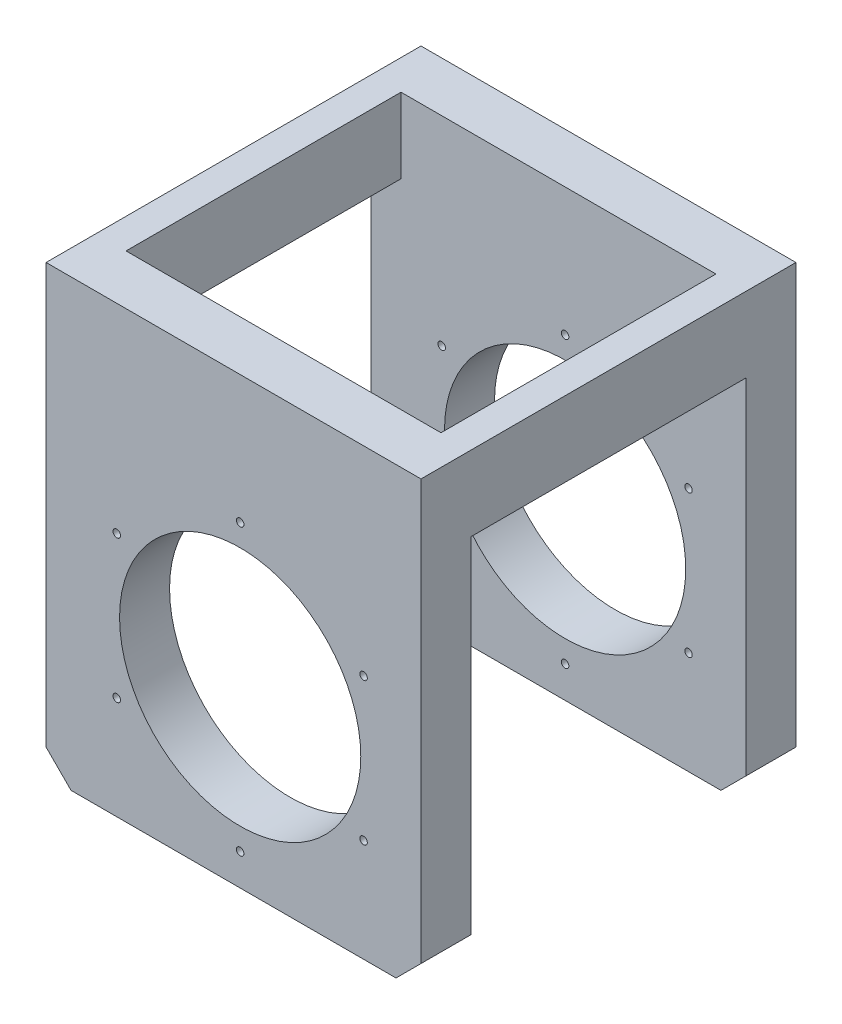
ISO-10303-21;
HEADER;
FILE_DESCRIPTION(('STEP AP214'),'2;1');
FILE_NAME('part.step','',(''),(''),'','','');
FILE_SCHEMA(('AUTOMOTIVE_DESIGN { 1 0 10303 214 1 1 1 1 }'));
ENDSEC;
DATA;
#1=APPLICATION_CONTEXT('core data for automotive mechanical design processes');
#2=APPLICATION_PROTOCOL_DEFINITION('international standard','automotive_design',2000,#1);
#3=PRODUCT_CONTEXT('',#1,'mechanical');
#4=PRODUCT('Part','Part','',(#3));
#5=PRODUCT_RELATED_PRODUCT_CATEGORY('part','',(#4));
#6=PRODUCT_DEFINITION_FORMATION('','',#4);
#7=PRODUCT_DEFINITION_CONTEXT('part definition',#1,'design');
#8=PRODUCT_DEFINITION('design','',#6,#7);
#9=PRODUCT_DEFINITION_SHAPE('','',#8);
#10=(LENGTH_UNIT() NAMED_UNIT(*) SI_UNIT(.MILLI.,.METRE.));
#11=(NAMED_UNIT(*) PLANE_ANGLE_UNIT() SI_UNIT($,.RADIAN.));
#12=(NAMED_UNIT(*) SI_UNIT($,.STERADIAN.) SOLID_ANGLE_UNIT());
#13=UNCERTAINTY_MEASURE_WITH_UNIT(LENGTH_MEASURE(1.E-05),#10,'distance_accuracy_value','');
#14=(GEOMETRIC_REPRESENTATION_CONTEXT(3) GLOBAL_UNCERTAINTY_ASSIGNED_CONTEXT((#13)) GLOBAL_UNIT_ASSIGNED_CONTEXT((#10,
#11,#12)) REPRESENTATION_CONTEXT('',''));
#15=CARTESIAN_POINT('',(0.,0.,0.));
#16=DIRECTION('',(0.,0.,1.));
#17=DIRECTION('',(1.,0.,0.));
#18=AXIS2_PLACEMENT_3D('',#15,#16,#17);
#19=CARTESIAN_POINT('',(-75.,-200.,20.));
#20=DIRECTION('',(0.,1.,0.));
#21=DIRECTION('',(0.,0.,1.));
#22=AXIS2_PLACEMENT_3D('',#19,#20,#21);
#23=PLANE('',#22);
#24=DIRECTION('',(1.,0.,0.));
#25=VECTOR('',#24,1.);
#26=CARTESIAN_POINT('',(0.,-200.,0.));
#27=LINE('',#26,#25);
#28=CARTESIAN_POINT('',(-65.,-200.,0.));
#29=VERTEX_POINT('',#28);
#30=CARTESIAN_POINT('',(64.9999999999999,-200.,0.));
#31=VERTEX_POINT('',#30);
#32=EDGE_CURVE('E410',#29,#31,#27,.T.);
#33=ORIENTED_EDGE('',*,*,#32,.T.);
#34=DIRECTION('',(0.,0.,1.));
#35=VECTOR('',#34,1.);
#36=CARTESIAN_POINT('',(64.9999999999999,-200.,20.));
#37=LINE('',#36,#35);
#38=CARTESIAN_POINT('',(64.9999999999999,-200.,20.));
#39=VERTEX_POINT('',#38);
#40=EDGE_CURVE('E275',#31,#39,#37,.T.);
#41=ORIENTED_EDGE('',*,*,#40,.T.);
#42=DIRECTION('',(1.,0.,0.));
#43=VECTOR('',#42,1.);
#44=CARTESIAN_POINT('',(-75.,-200.,20.));
#45=LINE('',#44,#43);
#46=CARTESIAN_POINT('',(-65.,-200.,20.));
#47=VERTEX_POINT('',#46);
#48=EDGE_CURVE('E245',#47,#39,#45,.T.);
#49=ORIENTED_EDGE('',*,*,#48,.F.);
#50=DIRECTION('',(0.,0.,-1.));
#51=VECTOR('',#50,1.);
#52=CARTESIAN_POINT('',(-65.,-200.,0.));
#53=LINE('',#52,#51);
#54=EDGE_CURVE('E271',#47,#29,#53,.T.);
#55=ORIENTED_EDGE('',*,*,#54,.T.);
#56=EDGE_LOOP('',(#33,#41,#49,#55));
#57=FACE_BOUND('',#56,.T.);
#58=ADVANCED_FACE('F100',(#57),#23,.F.);
#59=CARTESIAN_POINT('',(2.65519084204185,-130.335551325079,20.));
#60=DIRECTION('',(0.,0.,-1.));
#61=DIRECTION('',(-1.,0.,0.));
#62=AXIS2_PLACEMENT_3D('',#59,#60,#61);
#63=CYLINDRICAL_SURFACE('',#62,48.25);
#64=CARTESIAN_POINT('',(2.65519084204185,-130.335551325079,20.));
#65=DIRECTION('',(0.,0.,1.));
#66=DIRECTION('',(1.,0.,0.));
#67=AXIS2_PLACEMENT_3D('',#64,#65,#66);
#68=CIRCLE('',#67,48.25);
#69=CARTESIAN_POINT('',(50.9051908420419,-130.335551325079,20.));
#70=VERTEX_POINT('',#69);
#71=EDGE_CURVE('E351',#70,#70,#68,.T.);
#72=ORIENTED_EDGE('',*,*,#71,.T.);
#73=EDGE_LOOP('',(#72));
#74=FACE_BOUND('',#73,.T.);
#75=CARTESIAN_POINT('',(2.65519084204185,-130.335551325079,0.));
#76=DIRECTION('',(0.,0.,1.));
#77=DIRECTION('',(1.,0.,0.));
#78=AXIS2_PLACEMENT_3D('',#75,#76,#77);
#79=CIRCLE('',#78,48.25);
#80=CARTESIAN_POINT('',(50.9051908420419,-130.335551325079,0.));
#81=VERTEX_POINT('',#80);
#82=EDGE_CURVE('E345',#81,#81,#79,.T.);
#83=ORIENTED_EDGE('',*,*,#82,.F.);
#84=EDGE_LOOP('',(#83));
#85=FACE_BOUND('',#84,.T.);
#86=ADVANCED_FACE('F441',(#74,#85),#63,.F.);
#87=CARTESIAN_POINT('',(75.,-190.,20.));
#88=DIRECTION('',(-0.707106781186547,0.707106781186547,0.));
#89=DIRECTION('',(0.,0.,-1.));
#90=AXIS2_PLACEMENT_3D('',#87,#88,#89);
#91=PLANE('',#90);
#92=DIRECTION('',(-0.707106781186548,-0.707106781186548,0.));
#93=VECTOR('',#92,1.);
#94=CARTESIAN_POINT('',(132.5,-132.5,20.));
#95=LINE('',#94,#93);
#96=CARTESIAN_POINT('',(75.,-190.,20.));
#97=VERTEX_POINT('',#96);
#98=EDGE_CURVE('E281',#39,#97,#95,.F.);
#99=ORIENTED_EDGE('',*,*,#98,.F.);
#100=ORIENTED_EDGE('',*,*,#40,.F.);
#101=DIRECTION('',(0.707106781186548,0.707106781186548,0.));
#102=VECTOR('',#101,1.);
#103=CARTESIAN_POINT('',(75.,-190.,0.));
#104=LINE('',#103,#102);
#105=CARTESIAN_POINT('',(75.,-190.,0.));
#106=VERTEX_POINT('',#105);
#107=EDGE_CURVE('E268',#106,#31,#104,.F.);
#108=ORIENTED_EDGE('',*,*,#107,.F.);
#109=DIRECTION('',(0.,0.,-1.));
#110=VECTOR('',#109,1.);
#111=CARTESIAN_POINT('',(75.,-190.,20.));
#112=LINE('',#111,#110);
#113=EDGE_CURVE('E261',#97,#106,#112,.T.);
#114=ORIENTED_EDGE('',*,*,#113,.F.);
#115=EDGE_LOOP('',(#99,#100,#108,#114));
#116=FACE_BOUND('',#115,.T.);
#117=ADVANCED_FACE('F366',(#116),#91,.F.);
#118=CARTESIAN_POINT('',(-65.,-200.,20.));
#119=DIRECTION('',(-0.707106781186549,-0.707106781186546,0.));
#120=DIRECTION('',(0.,0.,1.));
#121=AXIS2_PLACEMENT_3D('',#118,#119,#120);
#122=PLANE('',#121);
#123=DIRECTION('',(0.707106781186546,-0.707106781186549,0.));
#124=VECTOR('',#123,1.);
#125=CARTESIAN_POINT('',(-132.5,-132.499999999999,20.));
#126=LINE('',#125,#124);
#127=CARTESIAN_POINT('',(-75.,-190.,20.));
#128=VERTEX_POINT('',#127);
#129=EDGE_CURVE('E278',#128,#47,#126,.T.);
#130=ORIENTED_EDGE('',*,*,#129,.F.);
#131=DIRECTION('',(0.,0.,1.));
#132=VECTOR('',#131,1.);
#133=CARTESIAN_POINT('',(-75.,-190.,20.));
#134=LINE('',#133,#132);
#135=CARTESIAN_POINT('',(-75.,-190.,0.));
#136=VERTEX_POINT('',#135);
#137=EDGE_CURVE('E110',#136,#128,#134,.T.);
#138=ORIENTED_EDGE('',*,*,#137,.F.);
#139=DIRECTION('',(-0.707106781186546,0.707106781186549,0.));
#140=VECTOR('',#139,1.);
#141=CARTESIAN_POINT('',(-65.,-200.,0.));
#142=LINE('',#141,#140);
#143=EDGE_CURVE('E265',#29,#136,#142,.T.);
#144=ORIENTED_EDGE('',*,*,#143,.F.);
#145=ORIENTED_EDGE('',*,*,#54,.F.);
#146=EDGE_LOOP('',(#130,#138,#144,#145));
#147=FACE_BOUND('',#146,.T.);
#148=ADVANCED_FACE('F103',(#147),#122,.T.);
#149=CARTESIAN_POINT('',(75.,-52.0855513250788,-110.));
#150=DIRECTION('',(0.,1.,0.));
#151=DIRECTION('',(0.,0.,1.));
#152=AXIS2_PLACEMENT_3D('',#149,#150,#151);
#153=PLANE('',#152);
#154=DIRECTION('',(0.,0.,-1.));
#155=VECTOR('',#154,1.);
#156=CARTESIAN_POINT('',(63.,-52.0855513250788,-110.));
#157=LINE('',#156,#155);
#158=CARTESIAN_POINT('',(63.,-52.0855513250788,0.));
#159=VERTEX_POINT('',#158);
#160=CARTESIAN_POINT('',(63.,-52.0855513250788,-110.));
#161=VERTEX_POINT('',#160);
#162=EDGE_CURVE('E404',#159,#161,#157,.T.);
#163=ORIENTED_EDGE('',*,*,#162,.T.);
#164=DIRECTION('',(-1.,0.,0.));
#165=VECTOR('',#164,1.);
#166=CARTESIAN_POINT('',(75.,-52.0855513250788,-110.));
#167=LINE('',#166,#165);
#168=CARTESIAN_POINT('',(75.,-52.0855513250788,-110.));
#169=VERTEX_POINT('',#168);
#170=EDGE_CURVE('E395',#169,#161,#167,.T.);
#171=ORIENTED_EDGE('',*,*,#170,.F.);
#172=DIRECTION('',(0.,0.,-1.));
#173=VECTOR('',#172,1.);
#174=CARTESIAN_POINT('',(75.,-52.0855513250788,-110.));
#175=LINE('',#174,#173);
#176=CARTESIAN_POINT('',(75.,-52.0855513250788,0.));
#177=VERTEX_POINT('',#176);
#178=EDGE_CURVE('E311',#177,#169,#175,.T.);
#179=ORIENTED_EDGE('',*,*,#178,.F.);
#180=DIRECTION('',(-1.,0.,0.));
#181=VECTOR('',#180,1.);
#182=CARTESIAN_POINT('',(75.,-52.0855513250788,0.));
#183=LINE('',#182,#181);
#184=EDGE_CURVE('E376',#177,#159,#183,.T.);
#185=ORIENTED_EDGE('',*,*,#184,.T.);
#186=EDGE_LOOP('',(#163,#171,#179,#185));
#187=FACE_BOUND('',#186,.T.);
#188=ADVANCED_FACE('F438',(#187),#153,.F.);
#189=CARTESIAN_POINT('',(75.,-190.,20.));
#190=DIRECTION('',(-0.707106781186547,0.707106781186547,0.));
#191=DIRECTION('',(0.,0.,-1.));
#192=AXIS2_PLACEMENT_3D('',#189,#190,#191);
#193=PLANE('',#192);
#194=DIRECTION('',(-0.707106781186548,-0.707106781186548,0.));
#195=VECTOR('',#194,1.);
#196=CARTESIAN_POINT('',(75.,-190.,-110.));
#197=LINE('',#196,#195);
#198=CARTESIAN_POINT('',(64.9999999999999,-200.,-110.));
#199=VERTEX_POINT('',#198);
#200=CARTESIAN_POINT('',(75.,-190.,-110.));
#201=VERTEX_POINT('',#200);
#202=EDGE_CURVE('E290',#199,#201,#197,.F.);
#203=ORIENTED_EDGE('',*,*,#202,.F.);
#204=DIRECTION('',(0.,0.,1.));
#205=VECTOR('',#204,1.);
#206=CARTESIAN_POINT('',(64.9999999999999,-200.,20.));
#207=LINE('',#206,#205);
#208=CARTESIAN_POINT('',(64.9999999999999,-200.,-130.));
#209=VERTEX_POINT('',#208);
#210=EDGE_CURVE('E287',#209,#199,#207,.T.);
#211=ORIENTED_EDGE('',*,*,#210,.F.);
#212=DIRECTION('',(0.707106781186548,0.707106781186548,0.));
#213=VECTOR('',#212,1.);
#214=CARTESIAN_POINT('',(132.5,-132.5,-130.));
#215=LINE('',#214,#213);
#216=CARTESIAN_POINT('',(75.,-190.,-130.));
#217=VERTEX_POINT('',#216);
#218=EDGE_CURVE('E284',#217,#209,#215,.F.);
#219=ORIENTED_EDGE('',*,*,#218,.F.);
#220=DIRECTION('',(0.,0.,-1.));
#221=VECTOR('',#220,1.);
#222=CARTESIAN_POINT('',(75.,-190.,20.));
#223=LINE('',#222,#221);
#224=EDGE_CURVE('E257',#201,#217,#223,.T.);
#225=ORIENTED_EDGE('',*,*,#224,.F.);
#226=EDGE_LOOP('',(#203,#211,#219,#225));
#227=FACE_BOUND('',#226,.T.);
#228=ADVANCED_FACE('F316',(#227),#193,.F.);
#229=DIRECTION('',(-1.,0.,0.));
#230=VECTOR('',#229,1.);
#231=CARTESIAN_POINT('',(75.,-200.,-130.));
#232=LINE('',#231,#230);
#233=CARTESIAN_POINT('',(-65.,-200.,-130.));
#234=VERTEX_POINT('',#233);
#235=EDGE_CURVE('E320',#209,#234,#232,.T.);
#236=ORIENTED_EDGE('',*,*,#235,.F.);
#237=ORIENTED_EDGE('',*,*,#210,.T.);
#238=DIRECTION('',(1.,0.,0.));
#239=VECTOR('',#238,1.);
#240=CARTESIAN_POINT('',(0.,-200.,-110.));
#241=LINE('',#240,#239);
#242=CARTESIAN_POINT('',(-65.,-200.,-110.));
#243=VERTEX_POINT('',#242);
#244=EDGE_CURVE('E303',#243,#199,#241,.T.);
#245=ORIENTED_EDGE('',*,*,#244,.F.);
#246=DIRECTION('',(0.,0.,-1.));
#247=VECTOR('',#246,1.);
#248=CARTESIAN_POINT('',(-65.,-200.,-130.));
#249=LINE('',#248,#247);
#250=EDGE_CURVE('E238',#243,#234,#249,.T.);
#251=ORIENTED_EDGE('',*,*,#250,.T.);
#252=EDGE_LOOP('',(#236,#237,#245,#251));
#253=FACE_BOUND('',#252,.T.);
#254=ADVANCED_FACE('F324',(#253),#23,.F.);
#255=CARTESIAN_POINT('',(-65.,-200.,20.));
#256=DIRECTION('',(-0.707106781186549,-0.707106781186546,0.));
#257=DIRECTION('',(0.,0.,1.));
#258=AXIS2_PLACEMENT_3D('',#255,#256,#257);
#259=PLANE('',#258);
#260=DIRECTION('',(0.707106781186546,-0.707106781186549,0.));
#261=VECTOR('',#260,1.);
#262=CARTESIAN_POINT('',(-65.,-200.,-110.));
#263=LINE('',#262,#261);
#264=CARTESIAN_POINT('',(-75.,-190.,-110.));
#265=VERTEX_POINT('',#264);
#266=EDGE_CURVE('E254',#265,#243,#263,.T.);
#267=ORIENTED_EDGE('',*,*,#266,.F.);
#268=DIRECTION('',(0.,0.,1.));
#269=VECTOR('',#268,1.);
#270=CARTESIAN_POINT('',(-75.,-190.,-110.));
#271=LINE('',#270,#269);
#272=CARTESIAN_POINT('',(-75.,-190.,-130.));
#273=VERTEX_POINT('',#272);
#274=EDGE_CURVE('E251',#273,#265,#271,.T.);
#275=ORIENTED_EDGE('',*,*,#274,.F.);
#276=DIRECTION('',(-0.707106781186546,0.707106781186549,0.));
#277=VECTOR('',#276,1.);
#278=CARTESIAN_POINT('',(-132.5,-132.499999999999,-130.));
#279=LINE('',#278,#277);
#280=EDGE_CURVE('E243',#234,#273,#279,.T.);
#281=ORIENTED_EDGE('',*,*,#280,.F.);
#282=ORIENTED_EDGE('',*,*,#250,.F.);
#283=EDGE_LOOP('',(#267,#275,#281,#282));
#284=FACE_BOUND('',#283,.T.);
#285=ADVANCED_FACE('F435',(#284),#259,.T.);
#286=DIRECTION('',(0.,0.,1.));
#287=VECTOR('',#286,1.);
#288=CARTESIAN_POINT('',(-63.,-52.0855513250788,-110.));
#289=LINE('',#288,#287);
#290=CARTESIAN_POINT('',(-63.,-52.0855513250788,-110.));
#291=VERTEX_POINT('',#290);
#292=CARTESIAN_POINT('',(-63.,-52.0855513250788,0.));
#293=VERTEX_POINT('',#292);
#294=EDGE_CURVE('E398',#291,#293,#289,.T.);
#295=ORIENTED_EDGE('',*,*,#294,.T.);
#296=CARTESIAN_POINT('',(-75.,-52.0855513250788,0.));
#297=VERTEX_POINT('',#296);
#298=EDGE_CURVE('E313',#293,#297,#183,.T.);
#299=ORIENTED_EDGE('',*,*,#298,.T.);
#300=DIRECTION('',(0.,0.,-1.));
#301=VECTOR('',#300,1.);
#302=CARTESIAN_POINT('',(-75.,-52.0855513250788,-110.));
#303=LINE('',#302,#301);
#304=CARTESIAN_POINT('',(-75.,-52.0855513250788,-110.));
#305=VERTEX_POINT('',#304);
#306=EDGE_CURVE('E384',#297,#305,#303,.T.);
#307=ORIENTED_EDGE('',*,*,#306,.T.);
#308=EDGE_CURVE('E399',#291,#305,#167,.T.);
#309=ORIENTED_EDGE('',*,*,#308,.F.);
#310=EDGE_LOOP('',(#295,#299,#307,#309));
#311=FACE_BOUND('',#310,.T.);
#312=ADVANCED_FACE('F423',(#311),#153,.F.);
#313=CARTESIAN_POINT('',(2.65519084204185,-130.335551325079,-130.));
#314=DIRECTION('',(0.,0.,1.));
#315=DIRECTION('',(1.,0.,0.));
#316=AXIS2_PLACEMENT_3D('',#313,#314,#315);
#317=CYLINDRICAL_SURFACE('',#316,48.25);
#318=CARTESIAN_POINT('',(2.65519084204185,-130.335551325079,-130.));
#319=DIRECTION('',(0.,0.,-1.));
#320=DIRECTION('',(-1.,0.,0.));
#321=AXIS2_PLACEMENT_3D('',#318,#319,#320);
#322=CIRCLE('',#321,48.25);
#323=CARTESIAN_POINT('',(-45.5948091579581,-130.335551325079,-130.));
#324=VERTEX_POINT('',#323);
#325=EDGE_CURVE('E333',#324,#324,#322,.T.);
#326=ORIENTED_EDGE('',*,*,#325,.T.);
#327=EDGE_LOOP('',(#326));
#328=FACE_BOUND('',#327,.T.);
#329=CARTESIAN_POINT('',(2.65519084204185,-130.335551325079,-110.));
#330=DIRECTION('',(0.,0.,-1.));
#331=DIRECTION('',(-1.,0.,0.));
#332=AXIS2_PLACEMENT_3D('',#329,#330,#331);
#333=CIRCLE('',#332,48.25);
#334=CARTESIAN_POINT('',(-45.5948091579581,-130.335551325079,-110.));
#335=VERTEX_POINT('',#334);
#336=EDGE_CURVE('E413',#335,#335,#333,.T.);
#337=ORIENTED_EDGE('',*,*,#336,.F.);
#338=EDGE_LOOP('',(#337));
#339=FACE_BOUND('',#338,.T.);
#340=ADVANCED_FACE('F421',(#328,#339),#317,.F.);
#341=CARTESIAN_POINT('',(0.,0.,-110.));
#342=DIRECTION('',(0.,0.,-1.));
#343=DIRECTION('',(-1.,0.,0.));
#344=AXIS2_PLACEMENT_3D('',#341,#342,#343);
#345=PLANE('',#344);
#346=CARTESIAN_POINT('',(2.65519084204629,-187.335551325079,-110.));
#347=DIRECTION('',(0.,0.,-1.));
#348=DIRECTION('',(-1.,0.,0.));
#349=AXIS2_PLACEMENT_3D('',#346,#347,#348);
#350=CIRCLE('',#349,1.5);
#351=CARTESIAN_POINT('',(1.15519084204629,-187.335551325079,-110.));
#352=VERTEX_POINT('',#351);
#353=EDGE_CURVE('E544',#352,#352,#350,.T.);
#354=ORIENTED_EDGE('',*,*,#353,.T.);
#355=EDGE_LOOP('',(#354));
#356=FACE_BOUND('',#355,.T.);
#357=CARTESIAN_POINT('',(52.0186388577584,-158.835551325077,-110.));
#358=DIRECTION('',(0.,0.,-1.));
#359=DIRECTION('',(-1.,0.,0.));
#360=AXIS2_PLACEMENT_3D('',#357,#358,#359);
#361=CIRCLE('',#360,1.5);
#362=CARTESIAN_POINT('',(50.5186388577584,-158.835551325077,-110.));
#363=VERTEX_POINT('',#362);
#364=EDGE_CURVE('E554',#363,#363,#361,.T.);
#365=ORIENTED_EDGE('',*,*,#364,.T.);
#366=EDGE_LOOP('',(#365));
#367=FACE_BOUND('',#366,.T.);
#368=CARTESIAN_POINT('',(-46.7082571736678,-158.83555132508,-110.));
#369=DIRECTION('',(0.,0.,-1.));
#370=DIRECTION('',(-1.,0.,0.));
#371=AXIS2_PLACEMENT_3D('',#368,#369,#370);
#372=CIRCLE('',#371,1.49999999999999);
#373=CARTESIAN_POINT('',(-48.2082571736678,-158.83555132508,-110.));
#374=VERTEX_POINT('',#373);
#375=EDGE_CURVE('E558',#374,#374,#372,.T.);
#376=ORIENTED_EDGE('',*,*,#375,.T.);
#377=EDGE_LOOP('',(#376));
#378=FACE_BOUND('',#377,.T.);
#379=CARTESIAN_POINT('',(2.65519084204185,-73.3355513250788,-110.));
#380=DIRECTION('',(0.,0.,-1.));
#381=DIRECTION('',(-1.,0.,0.));
#382=AXIS2_PLACEMENT_3D('',#379,#380,#381);
#383=CIRCLE('',#382,1.5);
#384=CARTESIAN_POINT('',(1.15519084204185,-73.3355513250788,-110.));
#385=VERTEX_POINT('',#384);
#386=EDGE_CURVE('E562',#385,#385,#383,.T.);
#387=ORIENTED_EDGE('',*,*,#386,.T.);
#388=EDGE_LOOP('',(#387));
#389=FACE_BOUND('',#388,.T.);
#390=CARTESIAN_POINT('',(-46.7082571736696,-101.83555132508,-110.));
#391=DIRECTION('',(0.,0.,-1.));
#392=DIRECTION('',(-1.,0.,0.));
#393=AXIS2_PLACEMENT_3D('',#390,#391,#392);
#394=CIRCLE('',#393,1.5);
#395=CARTESIAN_POINT('',(-48.2082571736696,-101.83555132508,-110.));
#396=VERTEX_POINT('',#395);
#397=EDGE_CURVE('E566',#396,#396,#394,.T.);
#398=ORIENTED_EDGE('',*,*,#397,.T.);
#399=EDGE_LOOP('',(#398));
#400=FACE_BOUND('',#399,.T.);
#401=CARTESIAN_POINT('',(52.0186388577561,-101.835551325077,-110.));
#402=DIRECTION('',(0.,0.,-1.));
#403=DIRECTION('',(-1.,0.,0.));
#404=AXIS2_PLACEMENT_3D('',#401,#402,#403);
#405=CIRCLE('',#404,1.5);
#406=CARTESIAN_POINT('',(50.5186388577561,-101.835551325077,-110.));
#407=VERTEX_POINT('',#406);
#408=EDGE_CURVE('E570',#407,#407,#405,.T.);
#409=ORIENTED_EDGE('',*,*,#408,.T.);
#410=EDGE_LOOP('',(#409));
#411=FACE_BOUND('',#410,.T.);
#412=ORIENTED_EDGE('',*,*,#336,.T.);
#413=EDGE_LOOP('',(#412));
#414=FACE_BOUND('',#413,.T.);
#415=DIRECTION('',(1.,0.,0.));
#416=VECTOR('',#415,1.);
#417=CARTESIAN_POINT('',(0.,-22.0855513250788,-110.));
#418=LINE('',#417,#416);
#419=CARTESIAN_POINT('',(-63.,-22.0855513250788,-110.));
#420=VERTEX_POINT('',#419);
#421=CARTESIAN_POINT('',(63.,-22.0855513250788,-110.));
#422=VERTEX_POINT('',#421);
#423=EDGE_CURVE('E12',#420,#422,#418,.T.);
#424=ORIENTED_EDGE('',*,*,#423,.F.);
#425=DIRECTION('',(0.,1.,0.));
#426=VECTOR('',#425,1.);
#427=CARTESIAN_POINT('',(-63.,-200.,-110.));
#428=LINE('',#427,#426);
#429=EDGE_CURVE('E340',#291,#420,#428,.T.);
#430=ORIENTED_EDGE('',*,*,#429,.F.);
#431=ORIENTED_EDGE('',*,*,#308,.T.);
#432=DIRECTION('',(0.,-1.,0.));
#433=VECTOR('',#432,1.);
#434=CARTESIAN_POINT('',(-75.,-200.,-110.));
#435=LINE('',#434,#433);
#436=EDGE_CURVE('E378',#305,#265,#435,.T.);
#437=ORIENTED_EDGE('',*,*,#436,.T.);
#438=ORIENTED_EDGE('',*,*,#266,.T.);
#439=ORIENTED_EDGE('',*,*,#244,.T.);
#440=ORIENTED_EDGE('',*,*,#202,.T.);
#441=DIRECTION('',(0.,-1.,0.));
#442=VECTOR('',#441,1.);
#443=CARTESIAN_POINT('',(75.,-200.,-110.));
#444=LINE('',#443,#442);
#445=EDGE_CURVE('E300',#169,#201,#444,.T.);
#446=ORIENTED_EDGE('',*,*,#445,.F.);
#447=ORIENTED_EDGE('',*,*,#170,.T.);
#448=DIRECTION('',(0.,-1.,0.));
#449=VECTOR('',#448,1.);
#450=CARTESIAN_POINT('',(63.,200.,-110.));
#451=LINE('',#450,#449);
#452=EDGE_CURVE('E337',#422,#161,#451,.T.);
#453=ORIENTED_EDGE('',*,*,#452,.F.);
#454=EDGE_LOOP('',(#424,#430,#431,#437,#438,#439,#440,#446,#447,#453));
#455=FACE_BOUND('',#454,.T.);
#456=ADVANCED_FACE('F298',(#356,#367,#378,#389,#400,#411,#414,#455),#345,.F.);
#457=CARTESIAN_POINT('',(-63.,-200.,-110.));
#458=DIRECTION('',(1.,0.,0.));
#459=DIRECTION('',(0.,0.,-1.));
#460=AXIS2_PLACEMENT_3D('',#457,#458,#459);
#461=PLANE('',#460);
#462=ORIENTED_EDGE('',*,*,#429,.T.);
#463=DIRECTION('',(0.,0.,1.));
#464=VECTOR('',#463,1.);
#465=CARTESIAN_POINT('',(-63.,-22.0855513250788,-110.));
#466=LINE('',#465,#464);
#467=CARTESIAN_POINT('',(-63.,-22.0855513250788,0.));
#468=VERTEX_POINT('',#467);
#469=EDGE_CURVE('E124',#420,#468,#466,.T.);
#470=ORIENTED_EDGE('',*,*,#469,.T.);
#471=DIRECTION('',(0.,1.,0.));
#472=VECTOR('',#471,1.);
#473=CARTESIAN_POINT('',(-63.,-200.,0.));
#474=LINE('',#473,#472);
#475=EDGE_CURVE('E341',#293,#468,#474,.T.);
#476=ORIENTED_EDGE('',*,*,#475,.F.);
#477=ORIENTED_EDGE('',*,*,#294,.F.);
#478=EDGE_LOOP('',(#462,#470,#476,#477));
#479=FACE_BOUND('',#478,.T.);
#480=ADVANCED_FACE('F431',(#479),#461,.T.);
#481=CARTESIAN_POINT('',(63.,200.,-110.));
#482=DIRECTION('',(-1.,0.,0.));
#483=DIRECTION('',(0.,0.,1.));
#484=AXIS2_PLACEMENT_3D('',#481,#482,#483);
#485=PLANE('',#484);
#486=DIRECTION('',(0.,-1.,0.));
#487=VECTOR('',#486,1.);
#488=CARTESIAN_POINT('',(63.,200.,0.));
#489=LINE('',#488,#487);
#490=CARTESIAN_POINT('',(63.,-22.0855513250788,0.));
#491=VERTEX_POINT('',#490);
#492=EDGE_CURVE('E331',#491,#159,#489,.T.);
#493=ORIENTED_EDGE('',*,*,#492,.F.);
#494=DIRECTION('',(0.,0.,-1.));
#495=VECTOR('',#494,1.);
#496=CARTESIAN_POINT('',(63.,-22.0855513250788,-110.));
#497=LINE('',#496,#495);
#498=EDGE_CURVE('E491',#491,#422,#497,.T.);
#499=ORIENTED_EDGE('',*,*,#498,.T.);
#500=ORIENTED_EDGE('',*,*,#452,.T.);
#501=ORIENTED_EDGE('',*,*,#162,.F.);
#502=EDGE_LOOP('',(#493,#499,#500,#501));
#503=FACE_BOUND('',#502,.T.);
#504=ADVANCED_FACE('F495',(#503),#485,.T.);
#505=CARTESIAN_POINT('',(0.,0.,-130.));
#506=DIRECTION('',(0.,0.,-1.));
#507=DIRECTION('',(-1.,0.,0.));
#508=AXIS2_PLACEMENT_3D('',#505,#506,#507);
#509=PLANE('',#508);
#510=CARTESIAN_POINT('',(2.65519084204629,-187.335551325079,-130.));
#511=DIRECTION('',(0.,0.,-1.));
#512=DIRECTION('',(-1.,0.,0.));
#513=AXIS2_PLACEMENT_3D('',#510,#511,#512);
#514=CIRCLE('',#513,1.5);
#515=CARTESIAN_POINT('',(1.15519084204629,-187.335551325079,-130.));
#516=VERTEX_POINT('',#515);
#517=EDGE_CURVE('E587',#516,#516,#514,.T.);
#518=ORIENTED_EDGE('',*,*,#517,.F.);
#519=EDGE_LOOP('',(#518));
#520=FACE_BOUND('',#519,.T.);
#521=CARTESIAN_POINT('',(52.0186388577584,-158.835551325077,-130.));
#522=DIRECTION('',(0.,0.,-1.));
#523=DIRECTION('',(-1.,0.,0.));
#524=AXIS2_PLACEMENT_3D('',#521,#522,#523);
#525=CIRCLE('',#524,1.5);
#526=CARTESIAN_POINT('',(50.5186388577584,-158.835551325077,-130.));
#527=VERTEX_POINT('',#526);
#528=EDGE_CURVE('E583',#527,#527,#525,.T.);
#529=ORIENTED_EDGE('',*,*,#528,.F.);
#530=EDGE_LOOP('',(#529));
#531=FACE_BOUND('',#530,.T.);
#532=CARTESIAN_POINT('',(-46.7082571736678,-158.83555132508,-130.));
#533=DIRECTION('',(0.,0.,-1.));
#534=DIRECTION('',(-1.,0.,0.));
#535=AXIS2_PLACEMENT_3D('',#532,#533,#534);
#536=CIRCLE('',#535,1.49999999999999);
#537=CARTESIAN_POINT('',(-48.2082571736678,-158.83555132508,-130.));
#538=VERTEX_POINT('',#537);
#539=EDGE_CURVE('E579',#538,#538,#536,.T.);
#540=ORIENTED_EDGE('',*,*,#539,.F.);
#541=EDGE_LOOP('',(#540));
#542=FACE_BOUND('',#541,.T.);
#543=CARTESIAN_POINT('',(2.65519084204185,-73.3355513250788,-130.));
#544=DIRECTION('',(0.,0.,-1.));
#545=DIRECTION('',(-1.,0.,0.));
#546=AXIS2_PLACEMENT_3D('',#543,#544,#545);
#547=CIRCLE('',#546,1.5);
#548=CARTESIAN_POINT('',(1.15519084204185,-73.3355513250788,-130.));
#549=VERTEX_POINT('',#548);
#550=EDGE_CURVE('E578',#549,#549,#547,.T.);
#551=ORIENTED_EDGE('',*,*,#550,.F.);
#552=EDGE_LOOP('',(#551));
#553=FACE_BOUND('',#552,.T.);
#554=CARTESIAN_POINT('',(-46.7082571736696,-101.83555132508,-130.));
#555=DIRECTION('',(0.,0.,-1.));
#556=DIRECTION('',(-1.,0.,0.));
#557=AXIS2_PLACEMENT_3D('',#554,#555,#556);
#558=CIRCLE('',#557,1.5);
#559=CARTESIAN_POINT('',(-48.2082571736696,-101.83555132508,-130.));
#560=VERTEX_POINT('',#559);
#561=EDGE_CURVE('E591',#560,#560,#558,.T.);
#562=ORIENTED_EDGE('',*,*,#561,.F.);
#563=EDGE_LOOP('',(#562));
#564=FACE_BOUND('',#563,.T.);
#565=CARTESIAN_POINT('',(52.0186388577561,-101.835551325077,-130.));
#566=DIRECTION('',(0.,0.,-1.));
#567=DIRECTION('',(-1.,0.,0.));
#568=AXIS2_PLACEMENT_3D('',#565,#566,#567);
#569=CIRCLE('',#568,1.5);
#570=CARTESIAN_POINT('',(50.5186388577561,-101.835551325077,-130.));
#571=VERTEX_POINT('',#570);
#572=EDGE_CURVE('E574',#571,#571,#569,.T.);
#573=ORIENTED_EDGE('',*,*,#572,.F.);
#574=EDGE_LOOP('',(#573));
#575=FACE_BOUND('',#574,.T.);
#576=ORIENTED_EDGE('',*,*,#325,.F.);
#577=EDGE_LOOP('',(#576));
#578=FACE_BOUND('',#577,.T.);
#579=DIRECTION('',(0.,1.,0.));
#580=VECTOR('',#579,1.);
#581=CARTESIAN_POINT('',(-75.,-200.,-130.));
#582=LINE('',#581,#580);
#583=CARTESIAN_POINT('',(-75.,-22.0855513250788,-130.));
#584=VERTEX_POINT('',#583);
#585=EDGE_CURVE('E327',#273,#584,#582,.T.);
#586=ORIENTED_EDGE('',*,*,#585,.T.);
#587=DIRECTION('',(1.,0.,0.));
#588=VECTOR('',#587,1.);
#589=CARTESIAN_POINT('',(0.,-22.0855513250788,-130.));
#590=LINE('',#589,#588);
#591=CARTESIAN_POINT('',(75.,-22.0855513250788,-130.));
#592=VERTEX_POINT('',#591);
#593=EDGE_CURVE('E216',#584,#592,#590,.T.);
#594=ORIENTED_EDGE('',*,*,#593,.T.);
#595=DIRECTION('',(0.,-1.,0.));
#596=VECTOR('',#595,1.);
#597=CARTESIAN_POINT('',(75.,200.,-130.));
#598=LINE('',#597,#596);
#599=EDGE_CURVE('E322',#592,#217,#598,.T.);
#600=ORIENTED_EDGE('',*,*,#599,.T.);
#601=ORIENTED_EDGE('',*,*,#218,.T.);
#602=ORIENTED_EDGE('',*,*,#235,.T.);
#603=ORIENTED_EDGE('',*,*,#280,.T.);
#604=EDGE_LOOP('',(#586,#594,#600,#601,#602,#603));
#605=FACE_BOUND('',#604,.T.);
#606=ADVANCED_FACE('F319',(#520,#531,#542,#553,#564,#575,#578,#605),#509,.T.);
#607=CARTESIAN_POINT('',(-75.,-200.,20.));
#608=DIRECTION('',(-1.,0.,0.));
#609=DIRECTION('',(0.,0.,1.));
#610=AXIS2_PLACEMENT_3D('',#607,#608,#609);
#611=PLANE('',#610);
#612=DIRECTION('',(0.,1.,0.));
#613=VECTOR('',#612,1.);
#614=CARTESIAN_POINT('',(-75.,-200.,20.));
#615=LINE('',#614,#613);
#616=CARTESIAN_POINT('',(-75.,-22.0855513250788,20.));
#617=VERTEX_POINT('',#616);
#618=EDGE_CURVE('E227',#128,#617,#615,.T.);
#619=ORIENTED_EDGE('',*,*,#618,.T.);
#620=DIRECTION('',(0.,0.,1.));
#621=VECTOR('',#620,1.);
#622=CARTESIAN_POINT('',(-75.,-22.0855513250788,-140.));
#623=LINE('',#622,#621);
#624=EDGE_CURVE('E212',#584,#617,#623,.T.);
#625=ORIENTED_EDGE('',*,*,#624,.F.);
#626=ORIENTED_EDGE('',*,*,#585,.F.);
#627=ORIENTED_EDGE('',*,*,#274,.T.);
#628=ORIENTED_EDGE('',*,*,#436,.F.);
#629=ORIENTED_EDGE('',*,*,#306,.F.);
#630=DIRECTION('',(0.,1.,0.));
#631=VECTOR('',#630,1.);
#632=CARTESIAN_POINT('',(-75.,-200.,0.));
#633=LINE('',#632,#631);
#634=EDGE_CURVE('E389',#136,#297,#633,.T.);
#635=ORIENTED_EDGE('',*,*,#634,.F.);
#636=ORIENTED_EDGE('',*,*,#137,.T.);
#637=EDGE_LOOP('',(#619,#625,#626,#627,#628,#629,#635,#636));
#638=FACE_BOUND('',#637,.T.);
#639=ADVANCED_FACE('F234',(#638),#611,.T.);
#640=CARTESIAN_POINT('',(75.,-200.,20.));
#641=DIRECTION('',(-1.,0.,0.));
#642=DIRECTION('',(0.,0.,1.));
#643=AXIS2_PLACEMENT_3D('',#640,#641,#642);
#644=PLANE('',#643);
#645=DIRECTION('',(0.,0.,1.));
#646=VECTOR('',#645,1.);
#647=CARTESIAN_POINT('',(75.,-22.0855513250788,-140.));
#648=LINE('',#647,#646);
#649=CARTESIAN_POINT('',(75.,-22.0855513250788,20.));
#650=VERTEX_POINT('',#649);
#651=EDGE_CURVE('E117',#592,#650,#648,.T.);
#652=ORIENTED_EDGE('',*,*,#651,.T.);
#653=DIRECTION('',(0.,1.,0.));
#654=VECTOR('',#653,1.);
#655=CARTESIAN_POINT('',(75.,-200.,20.));
#656=LINE('',#655,#654);
#657=EDGE_CURVE('E230',#97,#650,#656,.T.);
#658=ORIENTED_EDGE('',*,*,#657,.F.);
#659=ORIENTED_EDGE('',*,*,#113,.T.);
#660=DIRECTION('',(0.,1.,0.));
#661=VECTOR('',#660,1.);
#662=CARTESIAN_POINT('',(75.,-200.,0.));
#663=LINE('',#662,#661);
#664=EDGE_CURVE('E368',#106,#177,#663,.T.);
#665=ORIENTED_EDGE('',*,*,#664,.T.);
#666=ORIENTED_EDGE('',*,*,#178,.T.);
#667=ORIENTED_EDGE('',*,*,#445,.T.);
#668=ORIENTED_EDGE('',*,*,#224,.T.);
#669=ORIENTED_EDGE('',*,*,#599,.F.);
#670=EDGE_LOOP('',(#652,#658,#659,#665,#666,#667,#668,#669));
#671=FACE_BOUND('',#670,.T.);
#672=ADVANCED_FACE('F308',(#671),#644,.F.);
#673=CARTESIAN_POINT('',(0.,0.,0.));
#674=DIRECTION('',(0.,0.,1.));
#675=DIRECTION('',(1.,0.,0.));
#676=AXIS2_PLACEMENT_3D('',#673,#674,#675);
#677=PLANE('',#676);
#678=CARTESIAN_POINT('',(2.65519084204185,-73.3355513250788,0.));
#679=DIRECTION('',(0.,0.,1.));
#680=DIRECTION('',(1.,0.,0.));
#681=AXIS2_PLACEMENT_3D('',#678,#679,#680);
#682=CIRCLE('',#681,1.5);
#683=CARTESIAN_POINT('',(4.15519084204185,-73.3355513250788,0.));
#684=VERTEX_POINT('',#683);
#685=EDGE_CURVE('E232',#684,#684,#682,.F.);
#686=ORIENTED_EDGE('',*,*,#685,.F.);
#687=EDGE_LOOP('',(#686));
#688=FACE_BOUND('',#687,.T.);
#689=CARTESIAN_POINT('',(-46.7082571736696,-101.83555132508,0.));
#690=DIRECTION('',(0.,0.,1.));
#691=DIRECTION('',(1.,0.,0.));
#692=AXIS2_PLACEMENT_3D('',#689,#690,#691);
#693=CIRCLE('',#692,1.5);
#694=CARTESIAN_POINT('',(-45.2082571736696,-101.83555132508,0.));
#695=VERTEX_POINT('',#694);
#696=EDGE_CURVE('E540',#695,#695,#693,.F.);
#697=ORIENTED_EDGE('',*,*,#696,.F.);
#698=EDGE_LOOP('',(#697));
#699=FACE_BOUND('',#698,.T.);
#700=CARTESIAN_POINT('',(-46.7082571736678,-158.83555132508,0.));
#701=DIRECTION('',(0.,0.,1.));
#702=DIRECTION('',(1.,0.,0.));
#703=AXIS2_PLACEMENT_3D('',#700,#701,#702);
#704=CIRCLE('',#703,1.49999999999999);
#705=CARTESIAN_POINT('',(-45.2082571736678,-158.83555132508,0.));
#706=VERTEX_POINT('',#705);
#707=EDGE_CURVE('E508',#706,#706,#704,.F.);
#708=ORIENTED_EDGE('',*,*,#707,.F.);
#709=EDGE_LOOP('',(#708));
#710=FACE_BOUND('',#709,.T.);
#711=CARTESIAN_POINT('',(2.65519084204629,-187.335551325079,0.));
#712=DIRECTION('',(0.,0.,1.));
#713=DIRECTION('',(1.,0.,0.));
#714=AXIS2_PLACEMENT_3D('',#711,#712,#713);
#715=CIRCLE('',#714,1.5);
#716=CARTESIAN_POINT('',(4.15519084204629,-187.335551325079,0.));
#717=VERTEX_POINT('',#716);
#718=EDGE_CURVE('E507',#717,#717,#715,.F.);
#719=ORIENTED_EDGE('',*,*,#718,.F.);
#720=EDGE_LOOP('',(#719));
#721=FACE_BOUND('',#720,.T.);
#722=CARTESIAN_POINT('',(52.0186388577584,-158.835551325077,0.));
#723=DIRECTION('',(0.,0.,1.));
#724=DIRECTION('',(1.,0.,0.));
#725=AXIS2_PLACEMENT_3D('',#722,#723,#724);
#726=CIRCLE('',#725,1.5);
#727=CARTESIAN_POINT('',(53.5186388577584,-158.835551325077,0.));
#728=VERTEX_POINT('',#727);
#729=EDGE_CURVE('E517',#728,#728,#726,.F.);
#730=ORIENTED_EDGE('',*,*,#729,.F.);
#731=EDGE_LOOP('',(#730));
#732=FACE_BOUND('',#731,.T.);
#733=CARTESIAN_POINT('',(52.0186388577561,-101.835551325077,0.));
#734=DIRECTION('',(0.,0.,1.));
#735=DIRECTION('',(1.,0.,0.));
#736=AXIS2_PLACEMENT_3D('',#733,#734,#735);
#737=CIRCLE('',#736,1.5);
#738=CARTESIAN_POINT('',(53.5186388577561,-101.835551325077,0.));
#739=VERTEX_POINT('',#738);
#740=EDGE_CURVE('E525',#739,#739,#737,.F.);
#741=ORIENTED_EDGE('',*,*,#740,.F.);
#742=EDGE_LOOP('',(#741));
#743=FACE_BOUND('',#742,.T.);
#744=ORIENTED_EDGE('',*,*,#82,.T.);
#745=EDGE_LOOP('',(#744));
#746=FACE_BOUND('',#745,.T.);
#747=DIRECTION('',(-1.,0.,0.));
#748=VECTOR('',#747,1.);
#749=CARTESIAN_POINT('',(0.,-22.0855513250788,0.));
#750=LINE('',#749,#748);
#751=EDGE_CURVE('E488',#491,#468,#750,.T.);
#752=ORIENTED_EDGE('',*,*,#751,.F.);
#753=ORIENTED_EDGE('',*,*,#492,.T.);
#754=ORIENTED_EDGE('',*,*,#184,.F.);
#755=ORIENTED_EDGE('',*,*,#664,.F.);
#756=ORIENTED_EDGE('',*,*,#107,.T.);
#757=ORIENTED_EDGE('',*,*,#32,.F.);
#758=ORIENTED_EDGE('',*,*,#143,.T.);
#759=ORIENTED_EDGE('',*,*,#634,.T.);
#760=ORIENTED_EDGE('',*,*,#298,.F.);
#761=ORIENTED_EDGE('',*,*,#475,.T.);
#762=EDGE_LOOP('',(#752,#753,#754,#755,#756,#757,#758,#759,#760,#761));
#763=FACE_BOUND('',#762,.T.);
#764=ADVANCED_FACE('F372',(#688,#699,#710,#721,#732,#743,#746,#763),#677,.F.);
#765=CARTESIAN_POINT('',(0.,0.,20.));
#766=DIRECTION('',(0.,0.,1.));
#767=DIRECTION('',(1.,0.,0.));
#768=AXIS2_PLACEMENT_3D('',#765,#766,#767);
#769=PLANE('',#768);
#770=CARTESIAN_POINT('',(2.65519084204185,-73.3355513250788,20.));
#771=DIRECTION('',(0.,0.,1.));
#772=DIRECTION('',(1.,0.,0.));
#773=AXIS2_PLACEMENT_3D('',#770,#771,#772);
#774=CIRCLE('',#773,1.5);
#775=CARTESIAN_POINT('',(4.15519084204185,-73.3355513250788,20.));
#776=VERTEX_POINT('',#775);
#777=EDGE_CURVE('E533',#776,#776,#774,.T.);
#778=ORIENTED_EDGE('',*,*,#777,.F.);
#779=EDGE_LOOP('',(#778));
#780=FACE_BOUND('',#779,.T.);
#781=CARTESIAN_POINT('',(-46.7082571736696,-101.83555132508,20.));
#782=DIRECTION('',(0.,0.,1.));
#783=DIRECTION('',(1.,0.,0.));
#784=AXIS2_PLACEMENT_3D('',#781,#782,#783);
#785=CIRCLE('',#784,1.5);
#786=CARTESIAN_POINT('',(-45.2082571736696,-101.83555132508,20.));
#787=VERTEX_POINT('',#786);
#788=EDGE_CURVE('E512',#787,#787,#785,.T.);
#789=ORIENTED_EDGE('',*,*,#788,.F.);
#790=EDGE_LOOP('',(#789));
#791=FACE_BOUND('',#790,.T.);
#792=CARTESIAN_POINT('',(-46.7082571736678,-158.83555132508,20.));
#793=DIRECTION('',(0.,0.,1.));
#794=DIRECTION('',(1.,0.,0.));
#795=AXIS2_PLACEMENT_3D('',#792,#793,#794);
#796=CIRCLE('',#795,1.49999999999999);
#797=CARTESIAN_POINT('',(-45.2082571736678,-158.83555132508,20.));
#798=VERTEX_POINT('',#797);
#799=EDGE_CURVE('E503',#798,#798,#796,.T.);
#800=ORIENTED_EDGE('',*,*,#799,.F.);
#801=EDGE_LOOP('',(#800));
#802=FACE_BOUND('',#801,.T.);
#803=CARTESIAN_POINT('',(2.65519084204629,-187.335551325079,20.));
#804=DIRECTION('',(0.,0.,1.));
#805=DIRECTION('',(1.,0.,0.));
#806=AXIS2_PLACEMENT_3D('',#803,#804,#805);
#807=CIRCLE('',#806,1.5);
#808=CARTESIAN_POINT('',(4.15519084204629,-187.335551325079,20.));
#809=VERTEX_POINT('',#808);
#810=EDGE_CURVE('E513',#809,#809,#807,.T.);
#811=ORIENTED_EDGE('',*,*,#810,.F.);
#812=EDGE_LOOP('',(#811));
#813=FACE_BOUND('',#812,.T.);
#814=CARTESIAN_POINT('',(52.0186388577584,-158.835551325077,20.));
#815=DIRECTION('',(0.,0.,1.));
#816=DIRECTION('',(1.,0.,0.));
#817=AXIS2_PLACEMENT_3D('',#814,#815,#816);
#818=CIRCLE('',#817,1.5);
#819=CARTESIAN_POINT('',(53.5186388577584,-158.835551325077,20.));
#820=VERTEX_POINT('',#819);
#821=EDGE_CURVE('E521',#820,#820,#818,.T.);
#822=ORIENTED_EDGE('',*,*,#821,.F.);
#823=EDGE_LOOP('',(#822));
#824=FACE_BOUND('',#823,.T.);
#825=CARTESIAN_POINT('',(52.0186388577561,-101.835551325077,20.));
#826=DIRECTION('',(0.,0.,1.));
#827=DIRECTION('',(1.,0.,0.));
#828=AXIS2_PLACEMENT_3D('',#825,#826,#827);
#829=CIRCLE('',#828,1.5);
#830=CARTESIAN_POINT('',(53.5186388577561,-101.835551325077,20.));
#831=VERTEX_POINT('',#830);
#832=EDGE_CURVE('E529',#831,#831,#829,.T.);
#833=ORIENTED_EDGE('',*,*,#832,.F.);
#834=EDGE_LOOP('',(#833));
#835=FACE_BOUND('',#834,.T.);
#836=ORIENTED_EDGE('',*,*,#71,.F.);
#837=EDGE_LOOP('',(#836));
#838=FACE_BOUND('',#837,.T.);
#839=ORIENTED_EDGE('',*,*,#657,.T.);
#840=DIRECTION('',(-1.,0.,0.));
#841=VECTOR('',#840,1.);
#842=CARTESIAN_POINT('',(0.,-22.0855513250788,20.));
#843=LINE('',#842,#841);
#844=EDGE_CURVE('E215',#650,#617,#843,.T.);
#845=ORIENTED_EDGE('',*,*,#844,.T.);
#846=ORIENTED_EDGE('',*,*,#618,.F.);
#847=ORIENTED_EDGE('',*,*,#129,.T.);
#848=ORIENTED_EDGE('',*,*,#48,.T.);
#849=ORIENTED_EDGE('',*,*,#98,.T.);
#850=EDGE_LOOP('',(#839,#845,#846,#847,#848,#849));
#851=FACE_BOUND('',#850,.T.);
#852=ADVANCED_FACE('F226',(#780,#791,#802,#813,#824,#835,#838,#851),#769,.T.);
#853=CARTESIAN_POINT('',(0.,-22.0855513250788,-140.));
#854=DIRECTION('',(0.,1.,0.));
#855=DIRECTION('',(-1.,0.,0.));
#856=AXIS2_PLACEMENT_3D('',#853,#854,#855);
#857=PLANE('',#856);
#858=ORIENTED_EDGE('',*,*,#624,.T.);
#859=ORIENTED_EDGE('',*,*,#844,.F.);
#860=ORIENTED_EDGE('',*,*,#651,.F.);
#861=ORIENTED_EDGE('',*,*,#593,.F.);
#862=EDGE_LOOP('',(#858,#859,#860,#861));
#863=FACE_BOUND('',#862,.T.);
#864=ORIENTED_EDGE('',*,*,#751,.T.);
#865=ORIENTED_EDGE('',*,*,#469,.F.);
#866=ORIENTED_EDGE('',*,*,#423,.T.);
#867=ORIENTED_EDGE('',*,*,#498,.F.);
#868=EDGE_LOOP('',(#864,#865,#866,#867));
#869=FACE_BOUND('',#868,.T.);
#870=ADVANCED_FACE('F214',(#863,#869),#857,.T.);
#871=CARTESIAN_POINT('',(52.0186388577561,-101.835551325077,-130.001));
#872=DIRECTION('',(0.,0.,1.));
#873=DIRECTION('',(1.,0.,0.));
#874=AXIS2_PLACEMENT_3D('',#871,#872,#873);
#875=CYLINDRICAL_SURFACE('',#874,1.5);
#876=ORIENTED_EDGE('',*,*,#832,.T.);
#877=EDGE_LOOP('',(#876));
#878=FACE_BOUND('',#877,.T.);
#879=ORIENTED_EDGE('',*,*,#740,.T.);
#880=EDGE_LOOP('',(#879));
#881=FACE_BOUND('',#880,.T.);
#882=ADVANCED_FACE('F633',(#878,#881),#875,.F.);
#883=CARTESIAN_POINT('',(52.0186388577584,-158.835551325077,-130.001));
#884=DIRECTION('',(0.,0.,1.));
#885=DIRECTION('',(1.,0.,0.));
#886=AXIS2_PLACEMENT_3D('',#883,#884,#885);
#887=CYLINDRICAL_SURFACE('',#886,1.5);
#888=ORIENTED_EDGE('',*,*,#821,.T.);
#889=EDGE_LOOP('',(#888));
#890=FACE_BOUND('',#889,.T.);
#891=ORIENTED_EDGE('',*,*,#729,.T.);
#892=EDGE_LOOP('',(#891));
#893=FACE_BOUND('',#892,.T.);
#894=ADVANCED_FACE('F636',(#890,#893),#887,.F.);
#895=CARTESIAN_POINT('',(2.65519084204629,-187.335551325079,-130.001));
#896=DIRECTION('',(0.,0.,1.));
#897=DIRECTION('',(1.,0.,0.));
#898=AXIS2_PLACEMENT_3D('',#895,#896,#897);
#899=CYLINDRICAL_SURFACE('',#898,1.5);
#900=ORIENTED_EDGE('',*,*,#810,.T.);
#901=EDGE_LOOP('',(#900));
#902=FACE_BOUND('',#901,.T.);
#903=ORIENTED_EDGE('',*,*,#718,.T.);
#904=EDGE_LOOP('',(#903));
#905=FACE_BOUND('',#904,.T.);
#906=ADVANCED_FACE('F640',(#902,#905),#899,.F.);
#907=CARTESIAN_POINT('',(-46.7082571736678,-158.83555132508,-130.001));
#908=DIRECTION('',(0.,0.,1.));
#909=DIRECTION('',(1.,0.,0.));
#910=AXIS2_PLACEMENT_3D('',#907,#908,#909);
#911=CYLINDRICAL_SURFACE('',#910,1.49999999999999);
#912=ORIENTED_EDGE('',*,*,#799,.T.);
#913=EDGE_LOOP('',(#912));
#914=FACE_BOUND('',#913,.T.);
#915=ORIENTED_EDGE('',*,*,#707,.T.);
#916=EDGE_LOOP('',(#915));
#917=FACE_BOUND('',#916,.T.);
#918=ADVANCED_FACE('F631',(#914,#917),#911,.F.);
#919=CARTESIAN_POINT('',(-46.7082571736696,-101.83555132508,-130.001));
#920=DIRECTION('',(0.,0.,1.));
#921=DIRECTION('',(1.,0.,0.));
#922=AXIS2_PLACEMENT_3D('',#919,#920,#921);
#923=CYLINDRICAL_SURFACE('',#922,1.5);
#924=ORIENTED_EDGE('',*,*,#788,.T.);
#925=EDGE_LOOP('',(#924));
#926=FACE_BOUND('',#925,.T.);
#927=ORIENTED_EDGE('',*,*,#696,.T.);
#928=EDGE_LOOP('',(#927));
#929=FACE_BOUND('',#928,.T.);
#930=ADVANCED_FACE('F622',(#926,#929),#923,.F.);
#931=CARTESIAN_POINT('',(2.65519084204185,-73.3355513250788,-130.001));
#932=DIRECTION('',(0.,0.,1.));
#933=DIRECTION('',(1.,0.,0.));
#934=AXIS2_PLACEMENT_3D('',#931,#932,#933);
#935=CYLINDRICAL_SURFACE('',#934,1.5);
#936=ORIENTED_EDGE('',*,*,#777,.T.);
#937=EDGE_LOOP('',(#936));
#938=FACE_BOUND('',#937,.T.);
#939=ORIENTED_EDGE('',*,*,#685,.T.);
#940=EDGE_LOOP('',(#939));
#941=FACE_BOUND('',#940,.T.);
#942=ADVANCED_FACE('F612',(#938,#941),#935,.F.);
#943=CARTESIAN_POINT('',(52.0186388577561,-101.835551325077,20.));
#944=DIRECTION('',(0.,0.,-1.));
#945=DIRECTION('',(-1.,0.,0.));
#946=AXIS2_PLACEMENT_3D('',#943,#944,#945);
#947=CYLINDRICAL_SURFACE('',#946,1.5);
#948=ORIENTED_EDGE('',*,*,#572,.T.);
#949=EDGE_LOOP('',(#948));
#950=FACE_BOUND('',#949,.T.);
#951=ORIENTED_EDGE('',*,*,#408,.F.);
#952=EDGE_LOOP('',(#951));
#953=FACE_BOUND('',#952,.T.);
#954=ADVANCED_FACE('F609',(#950,#953),#947,.F.);
#955=CARTESIAN_POINT('',(-46.7082571736696,-101.83555132508,20.));
#956=DIRECTION('',(0.,0.,-1.));
#957=DIRECTION('',(-1.,0.,0.));
#958=AXIS2_PLACEMENT_3D('',#955,#956,#957);
#959=CYLINDRICAL_SURFACE('',#958,1.5);
#960=ORIENTED_EDGE('',*,*,#561,.T.);
#961=EDGE_LOOP('',(#960));
#962=FACE_BOUND('',#961,.T.);
#963=ORIENTED_EDGE('',*,*,#397,.F.);
#964=EDGE_LOOP('',(#963));
#965=FACE_BOUND('',#964,.T.);
#966=ADVANCED_FACE('F599',(#962,#965),#959,.F.);
#967=CARTESIAN_POINT('',(2.65519084204185,-73.3355513250788,20.));
#968=DIRECTION('',(0.,0.,-1.));
#969=DIRECTION('',(-1.,0.,0.));
#970=AXIS2_PLACEMENT_3D('',#967,#968,#969);
#971=CYLINDRICAL_SURFACE('',#970,1.5);
#972=ORIENTED_EDGE('',*,*,#550,.T.);
#973=EDGE_LOOP('',(#972));
#974=FACE_BOUND('',#973,.T.);
#975=ORIENTED_EDGE('',*,*,#386,.F.);
#976=EDGE_LOOP('',(#975));
#977=FACE_BOUND('',#976,.T.);
#978=ADVANCED_FACE('F619',(#974,#977),#971,.F.);
#979=CARTESIAN_POINT('',(-46.7082571736678,-158.83555132508,20.));
#980=DIRECTION('',(0.,0.,-1.));
#981=DIRECTION('',(-1.,0.,0.));
#982=AXIS2_PLACEMENT_3D('',#979,#980,#981);
#983=CYLINDRICAL_SURFACE('',#982,1.49999999999999);
#984=ORIENTED_EDGE('',*,*,#539,.T.);
#985=EDGE_LOOP('',(#984));
#986=FACE_BOUND('',#985,.T.);
#987=ORIENTED_EDGE('',*,*,#375,.F.);
#988=EDGE_LOOP('',(#987));
#989=FACE_BOUND('',#988,.T.);
#990=ADVANCED_FACE('F626',(#986,#989),#983,.F.);
#991=CARTESIAN_POINT('',(52.0186388577584,-158.835551325077,20.));
#992=DIRECTION('',(0.,0.,-1.));
#993=DIRECTION('',(-1.,0.,0.));
#994=AXIS2_PLACEMENT_3D('',#991,#992,#993);
#995=CYLINDRICAL_SURFACE('',#994,1.5);
#996=ORIENTED_EDGE('',*,*,#528,.T.);
#997=EDGE_LOOP('',(#996));
#998=FACE_BOUND('',#997,.T.);
#999=ORIENTED_EDGE('',*,*,#364,.F.);
#1000=EDGE_LOOP('',(#999));
#1001=FACE_BOUND('',#1000,.T.);
#1002=ADVANCED_FACE('F824',(#998,#1001),#995,.F.);
#1003=CARTESIAN_POINT('',(2.65519084204629,-187.335551325079,20.));
#1004=DIRECTION('',(0.,0.,-1.));
#1005=DIRECTION('',(-1.,0.,0.));
#1006=AXIS2_PLACEMENT_3D('',#1003,#1004,#1005);
#1007=CYLINDRICAL_SURFACE('',#1006,1.5);
#1008=ORIENTED_EDGE('',*,*,#517,.T.);
#1009=EDGE_LOOP('',(#1008));
#1010=FACE_BOUND('',#1009,.T.);
#1011=ORIENTED_EDGE('',*,*,#353,.F.);
#1012=EDGE_LOOP('',(#1011));
#1013=FACE_BOUND('',#1012,.T.);
#1014=ADVANCED_FACE('F832',(#1010,#1013),#1007,.F.);
#1015=CLOSED_SHELL('',(#58,#86,#117,#148,#188,#228,#254,#285,#312,#340,#456,#480,#504,#606,#639,
#672,#764,#852,#870,#882,#894,#906,#918,#930,#942,#954,#966,#978,#990,#1002,#1014));
#1016=MANIFOLD_SOLID_BREP('B2',#1015);
#1017=ADVANCED_BREP_SHAPE_REPRESENTATION('',(#18,#1016),#14);
#1018=SHAPE_DEFINITION_REPRESENTATION(#9,#1017);
ENDSEC;
END-ISO-10303-21;
